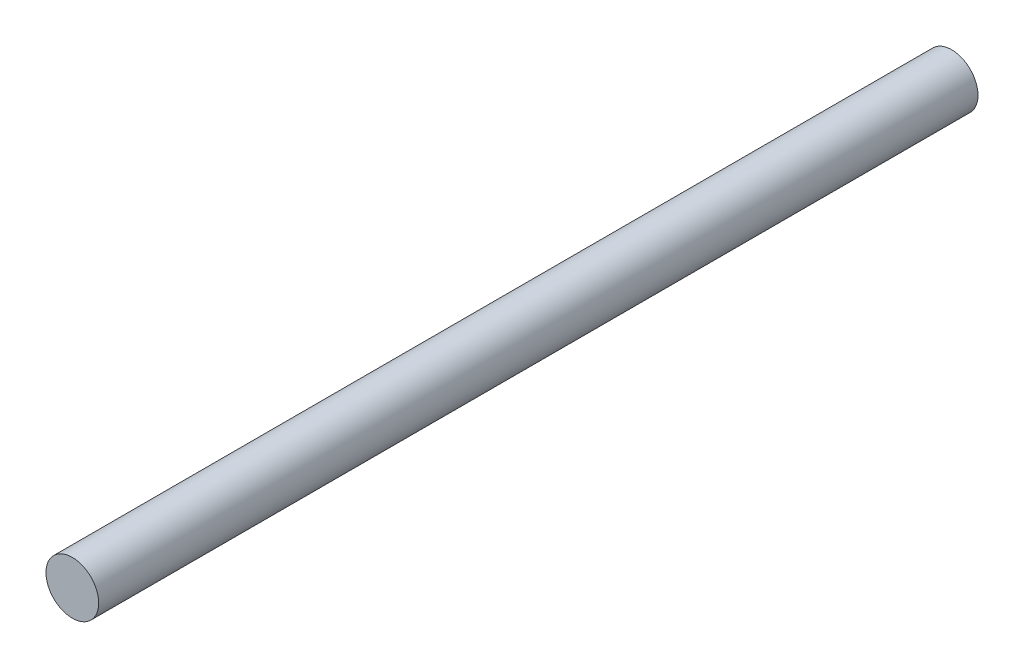
ISO-10303-21;
HEADER;
FILE_DESCRIPTION(('STEP AP214'),'2;1');
FILE_NAME('part.step','',(''),(''),'','','');
FILE_SCHEMA(('AUTOMOTIVE_DESIGN { 1 0 10303 214 1 1 1 1 }'));
ENDSEC;
DATA;
#1=APPLICATION_CONTEXT('core data for automotive mechanical design processes');
#2=APPLICATION_PROTOCOL_DEFINITION('international standard','automotive_design',2000,#1);
#3=PRODUCT_CONTEXT('',#1,'mechanical');
#4=PRODUCT('Part','Part','',(#3));
#5=PRODUCT_RELATED_PRODUCT_CATEGORY('part','',(#4));
#6=PRODUCT_DEFINITION_FORMATION('','',#4);
#7=PRODUCT_DEFINITION_CONTEXT('part definition',#1,'design');
#8=PRODUCT_DEFINITION('design','',#6,#7);
#9=PRODUCT_DEFINITION_SHAPE('','',#8);
#10=(LENGTH_UNIT() NAMED_UNIT(*) SI_UNIT(.MILLI.,.METRE.));
#11=(NAMED_UNIT(*) PLANE_ANGLE_UNIT() SI_UNIT($,.RADIAN.));
#12=(NAMED_UNIT(*) SI_UNIT($,.STERADIAN.) SOLID_ANGLE_UNIT());
#13=UNCERTAINTY_MEASURE_WITH_UNIT(LENGTH_MEASURE(1.E-05),#10,'distance_accuracy_value','');
#14=(GEOMETRIC_REPRESENTATION_CONTEXT(3) GLOBAL_UNCERTAINTY_ASSIGNED_CONTEXT((#13)) GLOBAL_UNIT_ASSIGNED_CONTEXT((#10,
#11,#12)) REPRESENTATION_CONTEXT('',''));
#15=CARTESIAN_POINT('',(0.,0.,0.));
#16=DIRECTION('',(0.,0.,1.));
#17=DIRECTION('',(1.,0.,0.));
#18=AXIS2_PLACEMENT_3D('',#15,#16,#17);
#19=CARTESIAN_POINT('',(0.,0.,200.));
#20=DIRECTION('',(0.,0.,-1.));
#21=DIRECTION('',(-1.,0.,0.));
#22=AXIS2_PLACEMENT_3D('',#19,#20,#21);
#23=CYLINDRICAL_SURFACE('',#22,6.);
#24=CARTESIAN_POINT('',(0.,0.,200.));
#25=DIRECTION('',(0.,0.,1.));
#26=DIRECTION('',(1.,0.,0.));
#27=AXIS2_PLACEMENT_3D('',#24,#25,#26);
#28=CIRCLE('',#27,6.);
#29=CARTESIAN_POINT('',(6.,0.,200.));
#30=VERTEX_POINT('',#29);
#31=EDGE_CURVE('E10',#30,#30,#28,.T.);
#32=ORIENTED_EDGE('',*,*,#31,.F.);
#33=EDGE_LOOP('',(#32));
#34=FACE_BOUND('',#33,.T.);
#35=CARTESIAN_POINT('',(0.,0.,0.));
#36=DIRECTION('',(0.,0.,1.));
#37=DIRECTION('',(1.,0.,0.));
#38=AXIS2_PLACEMENT_3D('',#35,#36,#37);
#39=CIRCLE('',#38,6.);
#40=CARTESIAN_POINT('',(6.,0.,0.));
#41=VERTEX_POINT('',#40);
#42=EDGE_CURVE('E37',#41,#41,#39,.T.);
#43=ORIENTED_EDGE('',*,*,#42,.T.);
#44=EDGE_LOOP('',(#43));
#45=FACE_BOUND('',#44,.T.);
#46=ADVANCED_FACE('F40',(#34,#45),#23,.T.);
#47=CARTESIAN_POINT('',(0.,0.,200.));
#48=DIRECTION('',(0.,0.,1.));
#49=DIRECTION('',(1.,0.,0.));
#50=AXIS2_PLACEMENT_3D('',#47,#48,#49);
#51=PLANE('',#50);
#52=ORIENTED_EDGE('',*,*,#31,.T.);
#53=EDGE_LOOP('',(#52));
#54=FACE_BOUND('',#53,.T.);
#55=ADVANCED_FACE('F55',(#54),#51,.T.);
#56=CARTESIAN_POINT('',(0.,0.,0.));
#57=DIRECTION('',(0.,0.,1.));
#58=DIRECTION('',(1.,0.,0.));
#59=AXIS2_PLACEMENT_3D('',#56,#57,#58);
#60=PLANE('',#59);
#61=ORIENTED_EDGE('',*,*,#42,.F.);
#62=EDGE_LOOP('',(#61));
#63=FACE_BOUND('',#62,.T.);
#64=ADVANCED_FACE('F49',(#63),#60,.F.);
#65=CLOSED_SHELL('',(#46,#55,#64));
#66=MANIFOLD_SOLID_BREP('B2',#65);
#67=ADVANCED_BREP_SHAPE_REPRESENTATION('',(#18,#66),#14);
#68=SHAPE_DEFINITION_REPRESENTATION(#9,#67);
ENDSEC;
END-ISO-10303-21;
